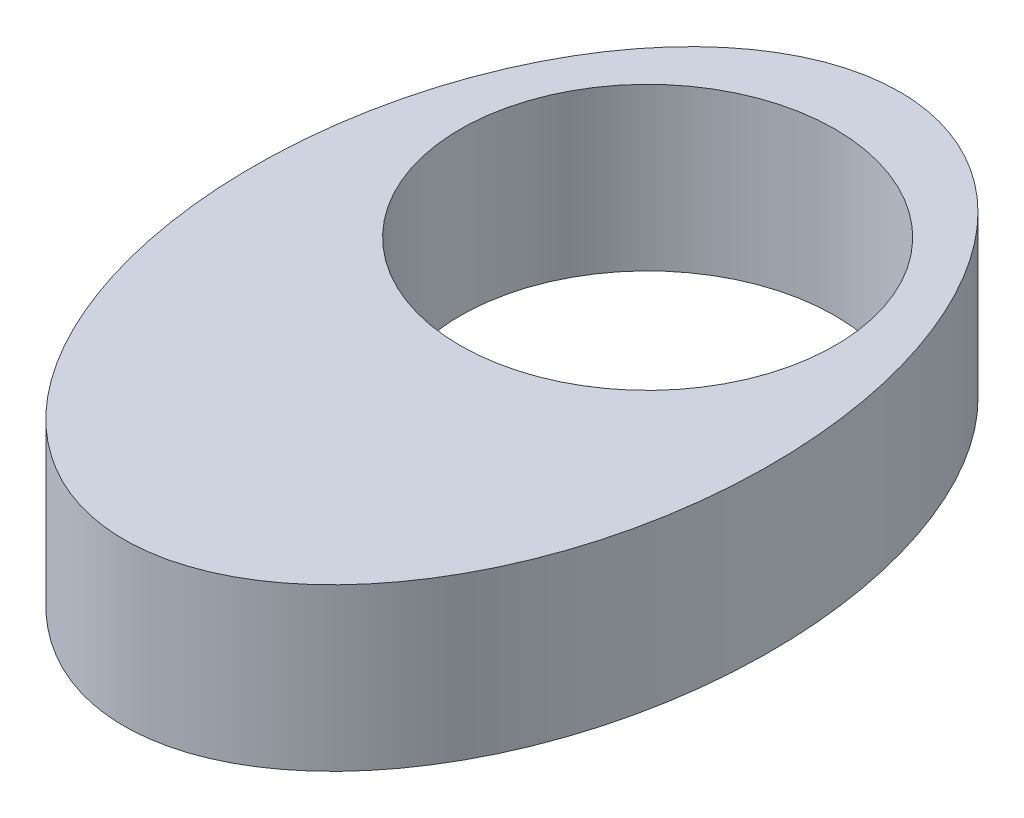
ISO-10303-21;
HEADER;
FILE_DESCRIPTION(('STEP AP214'),'2;1');
FILE_NAME('part.step','',(''),(''),'','','');
FILE_SCHEMA(('AUTOMOTIVE_DESIGN { 1 0 10303 214 1 1 1 1 }'));
ENDSEC;
DATA;
#1=APPLICATION_CONTEXT('core data for automotive mechanical design processes');
#2=APPLICATION_PROTOCOL_DEFINITION('international standard','automotive_design',2000,#1);
#3=PRODUCT_CONTEXT('',#1,'mechanical');
#4=PRODUCT('Part','Part','',(#3));
#5=PRODUCT_RELATED_PRODUCT_CATEGORY('part','',(#4));
#6=PRODUCT_DEFINITION_FORMATION('','',#4);
#7=PRODUCT_DEFINITION_CONTEXT('part definition',#1,'design');
#8=PRODUCT_DEFINITION('design','',#6,#7);
#9=PRODUCT_DEFINITION_SHAPE('','',#8);
#10=(LENGTH_UNIT() NAMED_UNIT(*) SI_UNIT(.MILLI.,.METRE.));
#11=(NAMED_UNIT(*) PLANE_ANGLE_UNIT() SI_UNIT($,.RADIAN.));
#12=(NAMED_UNIT(*) SI_UNIT($,.STERADIAN.) SOLID_ANGLE_UNIT());
#13=UNCERTAINTY_MEASURE_WITH_UNIT(LENGTH_MEASURE(1.E-05),#10,'distance_accuracy_value','');
#14=(GEOMETRIC_REPRESENTATION_CONTEXT(3) GLOBAL_UNCERTAINTY_ASSIGNED_CONTEXT((#13)) GLOBAL_UNIT_ASSIGNED_CONTEXT((#10,
#11,#12)) REPRESENTATION_CONTEXT('',''));
#15=CARTESIAN_POINT('',(0.,0.,0.));
#16=DIRECTION('',(0.,0.,1.));
#17=DIRECTION('',(1.,0.,0.));
#18=AXIS2_PLACEMENT_3D('',#15,#16,#17);
#19=CARTESIAN_POINT('',(0.,25.,-21.));
#20=DIRECTION('',(0.,-1.,0.));
#21=DIRECTION('',(0.,0.,-1.));
#22=AXIS2_PLACEMENT_3D('',#19,#20,#21);
#23=CYLINDRICAL_SURFACE('',#22,29.);
#24=CARTESIAN_POINT('',(0.,25.,-21.));
#25=DIRECTION('',(0.,1.,0.));
#26=DIRECTION('',(0.,0.,1.));
#27=AXIS2_PLACEMENT_3D('',#24,#25,#26);
#28=CIRCLE('',#27,29.);
#29=CARTESIAN_POINT('',(0.,25.,8.));
#30=VERTEX_POINT('',#29);
#31=EDGE_CURVE('E44',#30,#30,#28,.T.);
#32=ORIENTED_EDGE('',*,*,#31,.T.);
#33=EDGE_LOOP('',(#32));
#34=FACE_BOUND('',#33,.T.);
#35=CARTESIAN_POINT('',(0.,0.,-21.));
#36=DIRECTION('',(0.,1.,0.));
#37=DIRECTION('',(0.,0.,1.));
#38=AXIS2_PLACEMENT_3D('',#35,#36,#37);
#39=CIRCLE('',#38,29.);
#40=CARTESIAN_POINT('',(0.,0.,8.));
#41=VERTEX_POINT('',#40);
#42=EDGE_CURVE('E51',#41,#41,#39,.T.);
#43=ORIENTED_EDGE('',*,*,#42,.F.);
#44=EDGE_LOOP('',(#43));
#45=FACE_BOUND('',#44,.T.);
#46=ADVANCED_FACE('F37',(#34,#45),#23,.F.);
#47=CARTESIAN_POINT('',(0.,25.,0.));
#48=DIRECTION('',(0.,1.,0.));
#49=DIRECTION('',(0.,0.,-1.));
#50=AXIS2_PLACEMENT_3D('',#47,#48,#49);
#51=ELLIPSE('',#50,60.,40.);
#52=DIRECTION('',(0.,-1.,0.));
#53=VECTOR('',#52,1.);
#54=SURFACE_OF_LINEAR_EXTRUSION('',#51,#53);
#55=CARTESIAN_POINT('',(0.,25.,-60.));
#56=VERTEX_POINT('',#55);
#57=EDGE_CURVE('E10',#56,#56,#51,.T.);
#58=ORIENTED_EDGE('',*,*,#57,.F.);
#59=EDGE_LOOP('',(#58));
#60=FACE_BOUND('',#59,.T.);
#61=CARTESIAN_POINT('',(0.,0.,0.));
#62=DIRECTION('',(0.,1.,0.));
#63=DIRECTION('',(0.,0.,-1.));
#64=AXIS2_PLACEMENT_3D('',#61,#62,#63);
#65=ELLIPSE('',#64,60.,40.);
#66=CARTESIAN_POINT('',(0.,0.,-60.));
#67=VERTEX_POINT('',#66);
#68=EDGE_CURVE('E40',#67,#67,#65,.T.);
#69=ORIENTED_EDGE('',*,*,#68,.T.);
#70=EDGE_LOOP('',(#69));
#71=FACE_BOUND('',#70,.T.);
#72=ADVANCED_FACE('F52',(#60,#71),#54,.F.);
#73=CARTESIAN_POINT('',(0.,25.,0.));
#74=DIRECTION('',(0.,1.,0.));
#75=DIRECTION('',(0.,0.,1.));
#76=AXIS2_PLACEMENT_3D('',#73,#74,#75);
#77=PLANE('',#76);
#78=ORIENTED_EDGE('',*,*,#31,.F.);
#79=EDGE_LOOP('',(#78));
#80=FACE_BOUND('',#79,.T.);
#81=ORIENTED_EDGE('',*,*,#57,.T.);
#82=EDGE_LOOP('',(#81));
#83=FACE_BOUND('',#82,.T.);
#84=ADVANCED_FACE('F55',(#80,#83),#77,.T.);
#85=CARTESIAN_POINT('',(0.,0.,0.));
#86=DIRECTION('',(0.,1.,0.));
#87=DIRECTION('',(0.,0.,1.));
#88=AXIS2_PLACEMENT_3D('',#85,#86,#87);
#89=PLANE('',#88);
#90=ORIENTED_EDGE('',*,*,#42,.T.);
#91=EDGE_LOOP('',(#90));
#92=FACE_BOUND('',#91,.T.);
#93=ORIENTED_EDGE('',*,*,#68,.F.);
#94=EDGE_LOOP('',(#93));
#95=FACE_BOUND('',#94,.T.);
#96=ADVANCED_FACE('F57',(#92,#95),#89,.F.);
#97=CLOSED_SHELL('',(#46,#72,#84,#96));
#98=MANIFOLD_SOLID_BREP('B2',#97);
#99=ADVANCED_BREP_SHAPE_REPRESENTATION('',(#18,#98),#14);
#100=SHAPE_DEFINITION_REPRESENTATION(#9,#99);
ENDSEC;
END-ISO-10303-21;
